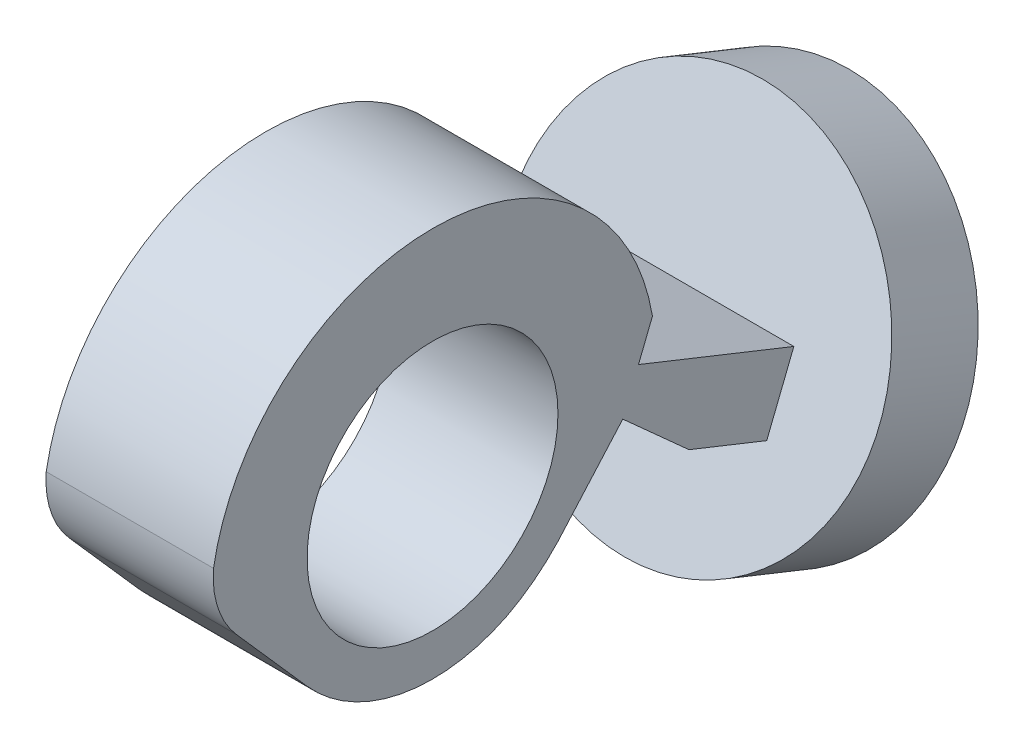
ISO-10303-21;
HEADER;
FILE_DESCRIPTION(('STEP AP214'),'2;1');
FILE_NAME('part.step','',(''),(''),'','','');
FILE_SCHEMA(('AUTOMOTIVE_DESIGN { 1 0 10303 214 1 1 1 1 }'));
ENDSEC;
DATA;
#1=APPLICATION_CONTEXT('core data for automotive mechanical design processes');
#2=APPLICATION_PROTOCOL_DEFINITION('international standard','automotive_design',2000,#1);
#3=PRODUCT_CONTEXT('',#1,'mechanical');
#4=PRODUCT('Part','Part','',(#3));
#5=PRODUCT_RELATED_PRODUCT_CATEGORY('part','',(#4));
#6=PRODUCT_DEFINITION_FORMATION('','',#4);
#7=PRODUCT_DEFINITION_CONTEXT('part definition',#1,'design');
#8=PRODUCT_DEFINITION('design','',#6,#7);
#9=PRODUCT_DEFINITION_SHAPE('','',#8);
#10=(LENGTH_UNIT() NAMED_UNIT(*) SI_UNIT(.MILLI.,.METRE.));
#11=(NAMED_UNIT(*) PLANE_ANGLE_UNIT() SI_UNIT($,.RADIAN.));
#12=(NAMED_UNIT(*) SI_UNIT($,.STERADIAN.) SOLID_ANGLE_UNIT());
#13=UNCERTAINTY_MEASURE_WITH_UNIT(LENGTH_MEASURE(1.E-05),#10,'distance_accuracy_value','');
#14=(GEOMETRIC_REPRESENTATION_CONTEXT(3) GLOBAL_UNCERTAINTY_ASSIGNED_CONTEXT((#13)) GLOBAL_UNIT_ASSIGNED_CONTEXT((#10,
#11,#12)) REPRESENTATION_CONTEXT('',''));
#15=CARTESIAN_POINT('',(0.,0.,0.));
#16=DIRECTION('',(0.,0.,1.));
#17=DIRECTION('',(1.,0.,0.));
#18=AXIS2_PLACEMENT_3D('',#15,#16,#17);
#19=CARTESIAN_POINT('',(9.,14.025494773348,-10.1138171957374));
#20=DIRECTION('',(1.,0.,0.));
#21=DIRECTION('',(0.,0.,-1.));
#22=AXIS2_PLACEMENT_3D('',#19,#20,#21);
#23=PLANE('',#22);
#24=DIRECTION('',(0.,0.668897649954775,0.743354514269591));
#25=VECTOR('',#24,1.);
#26=CARTESIAN_POINT('',(9.,17.9886332204524,-13.6799944944901));
#27=LINE('',#26,#25);
#28=CARTESIAN_POINT('',(9.,8.79597256603114,-23.8959158631397));
#29=VERTEX_POINT('',#28);
#30=CARTESIAN_POINT('',(9.,12.0039051069543,-20.3308993977227));
#31=VERTEX_POINT('',#30);
#32=EDGE_CURVE('E184',#29,#31,#27,.T.);
#33=ORIENTED_EDGE('',*,*,#32,.F.);
#34=DIRECTION('',(0.,0.370588457757987,0.928797176447343));
#35=VECTOR('',#34,1.);
#36=CARTESIAN_POINT('',(9.,10.4636206259421,-19.7163285691267));
#37=LINE('',#36,#35);
#38=CARTESIAN_POINT('',(9.,7.1283245061202,-28.0755031571527));
#39=VERTEX_POINT('',#38);
#40=EDGE_CURVE('E190',#39,#29,#37,.T.);
#41=ORIENTED_EDGE('',*,*,#40,.F.);
#42=DIRECTION('',(0.,0.928797176447343,-0.370588457757988));
#43=VECTOR('',#42,1.);
#44=CARTESIAN_POINT('',(9.,13.5738752916926,-30.6472667085479));
#45=LINE('',#44,#43);
#46=CARTESIAN_POINT('',(9.,10.7874837623506,-29.535501335274));
#47=VERTEX_POINT('',#46);
#48=EDGE_CURVE('E212',#39,#47,#45,.T.);
#49=ORIENTED_EDGE('',*,*,#48,.T.);
#50=DIRECTION('',(0.,-0.370588457757987,-0.928797176447343));
#51=VECTOR('',#50,1.);
#52=CARTESIAN_POINT('',(9.,10.7874837623506,-29.535501335274));
#53=LINE('',#52,#51);
#54=CARTESIAN_POINT('',(9.,14.1227798821725,-21.1763267472479));
#55=VERTEX_POINT('',#54);
#56=EDGE_CURVE('E199',#55,#47,#53,.T.);
#57=ORIENTED_EDGE('',*,*,#56,.F.);
#58=DIRECTION('',(0.,0.928797176447343,-0.370588457757987));
#59=VECTOR('',#58,1.);
#60=CARTESIAN_POINT('',(9.,14.1227798821725,-21.1763267472479));
#61=LINE('',#60,#59);
#62=CARTESIAN_POINT('',(9.,16.0039051069543,-21.9268924397148));
#63=VERTEX_POINT('',#62);
#64=EDGE_CURVE('E205',#55,#63,#61,.T.);
#65=ORIENTED_EDGE('',*,*,#64,.T.);
#66=CARTESIAN_POINT('',(9.,14.025494773348,-10.1138171957374));
#67=DIRECTION('',(1.,0.,0.));
#68=DIRECTION('',(0.,0.,-1.));
#69=AXIS2_PLACEMENT_3D('',#66,#67,#68);
#70=CIRCLE('',#69,11.977598013291);
#71=CARTESIAN_POINT('',(9.,16.0631168379134,1.68918879807576));
#72=VERTEX_POINT('',#71);
#73=EDGE_CURVE('E227',#63,#72,#70,.T.);
#74=ORIENTED_EDGE('',*,*,#73,.T.);
#75=CARTESIAN_POINT('',(9.,15.6665736708839,-3.29505313399469));
#76=DIRECTION('',(1.,0.,0.));
#77=DIRECTION('',(0.,0.,-1.));
#78=AXIS2_PLACEMENT_3D('',#75,#76,#77);
#79=CIRCLE('',#78,4.99999141206534);
#80=CARTESIAN_POINT('',(9.,12.3593919486514,0.454941956249968));
#81=VERTEX_POINT('',#80);
#82=EDGE_CURVE('E230',#72,#81,#79,.T.);
#83=ORIENTED_EDGE('',*,*,#82,.T.);
#84=DIRECTION('',(0.,-0.750000306239657,-0.661437480522854));
#85=VECTOR('',#84,1.);
#86=CARTESIAN_POINT('',(9.,12.3593919486514,0.454941956249968));
#87=LINE('',#86,#85);
#88=CARTESIAN_POINT('',(9.,8.0509660945459,-3.34472894821562));
#89=VERTEX_POINT('',#88);
#90=EDGE_CURVE('E233',#81,#89,#87,.T.);
#91=ORIENTED_EDGE('',*,*,#90,.T.);
#92=CARTESIAN_POINT('',(9.,14.0039030768003,-10.094731316069));
#93=DIRECTION('',(1.,0.,0.));
#94=DIRECTION('',(0.,0.,-1.));
#95=AXIS2_PLACEMENT_3D('',#92,#93,#94);
#96=CIRCLE('',#95,8.99999948226211);
#97=CARTESIAN_POINT('',(9.,5.92608719008415,-14.0632173222222));
#98=VERTEX_POINT('',#97);
#99=EDGE_CURVE('E235',#89,#98,#96,.T.);
#100=ORIENTED_EDGE('',*,*,#99,.T.);
#101=CARTESIAN_POINT('',(9.,14.9561374576593,-9.36729896403544));
#102=DIRECTION('',(1.,0.,0.));
#103=DIRECTION('',(0.,0.,-1.));
#104=AXIS2_PLACEMENT_3D('',#101,#102,#103);
#105=CIRCLE('',#104,10.1780871022844);
#106=CARTESIAN_POINT('',(9.,8.05096321242302,-16.8447333973564));
#107=VERTEX_POINT('',#106);
#108=EDGE_CURVE('E237',#98,#107,#105,.T.);
#109=ORIENTED_EDGE('',*,*,#108,.T.);
#110=DIRECTION('',(0.,0.750000100362902,-0.661437713965296));
#111=VECTOR('',#110,1.);
#112=CARTESIAN_POINT('',(9.,8.05096321242302,-16.8447333973564));
#113=LINE('',#112,#111);
#114=EDGE_CURVE('E239',#107,#31,#113,.T.);
#115=ORIENTED_EDGE('',*,*,#114,.T.);
#116=EDGE_LOOP('',(#33,#41,#49,#57,#65,#74,#83,#91,#100,#109,#115));
#117=FACE_BOUND('',#116,.T.);
#118=CARTESIAN_POINT('',(9.,14.0039030768003,-10.094731316069));
#119=DIRECTION('',(1.,0.,0.));
#120=DIRECTION('',(0.,0.,-1.));
#121=AXIS2_PLACEMENT_3D('',#118,#119,#120);
#122=CIRCLE('',#121,6.75000198519631);
#123=CARTESIAN_POINT('',(9.,14.0039030768003,-16.8447333012653));
#124=VERTEX_POINT('',#123);
#125=EDGE_CURVE('E221',#124,#124,#122,.T.);
#126=ORIENTED_EDGE('',*,*,#125,.F.);
#127=EDGE_LOOP('',(#126));
#128=FACE_BOUND('',#127,.T.);
#129=ADVANCED_FACE('F39',(#117,#128),#23,.T.);
#130=CARTESIAN_POINT('',(0.,14.025494773348,-10.1138171957374));
#131=DIRECTION('',(1.,0.,0.));
#132=DIRECTION('',(0.,0.,-1.));
#133=AXIS2_PLACEMENT_3D('',#130,#131,#132);
#134=PLANE('',#133);
#135=CARTESIAN_POINT('',(0.,14.0039030768003,-10.094731316069));
#136=DIRECTION('',(1.,0.,0.));
#137=DIRECTION('',(0.,0.,-1.));
#138=AXIS2_PLACEMENT_3D('',#135,#136,#137);
#139=CIRCLE('',#138,6.75000198519631);
#140=CARTESIAN_POINT('',(0.,14.0039030768003,-16.8447333012653));
#141=VERTEX_POINT('',#140);
#142=EDGE_CURVE('E220',#141,#141,#139,.T.);
#143=ORIENTED_EDGE('',*,*,#142,.T.);
#144=EDGE_LOOP('',(#143));
#145=FACE_BOUND('',#144,.T.);
#146=DIRECTION('',(0.,-0.370588457757987,-0.928797176447343));
#147=VECTOR('',#146,1.);
#148=CARTESIAN_POINT('',(0.,10.4636206259421,-19.7163285691267));
#149=LINE('',#148,#147);
#150=CARTESIAN_POINT('',(0.,8.79597256603114,-23.8959158631397));
#151=VERTEX_POINT('',#150);
#152=CARTESIAN_POINT('',(0.,7.1283245061202,-28.0755031571527));
#153=VERTEX_POINT('',#152);
#154=EDGE_CURVE('E186',#151,#153,#149,.T.);
#155=ORIENTED_EDGE('',*,*,#154,.F.);
#156=DIRECTION('',(0.,-0.668897649954775,-0.743354514269591));
#157=VECTOR('',#156,1.);
#158=CARTESIAN_POINT('',(0.,12.0039051069543,-20.3308993977227));
#159=LINE('',#158,#157);
#160=CARTESIAN_POINT('',(0.,12.0039051069543,-20.3308993977227));
#161=VERTEX_POINT('',#160);
#162=EDGE_CURVE('E61',#161,#151,#159,.T.);
#163=ORIENTED_EDGE('',*,*,#162,.F.);
#164=DIRECTION('',(0.,0.750000100362902,-0.661437713965296));
#165=VECTOR('',#164,1.);
#166=CARTESIAN_POINT('',(0.,8.05096321242302,-16.8447333973564));
#167=LINE('',#166,#165);
#168=CARTESIAN_POINT('',(0.,8.05096321242302,-16.8447333973564));
#169=VERTEX_POINT('',#168);
#170=EDGE_CURVE('E231',#169,#161,#167,.T.);
#171=ORIENTED_EDGE('',*,*,#170,.F.);
#172=CARTESIAN_POINT('',(0.,14.9561374576593,-9.36729896403544));
#173=DIRECTION('',(1.,0.,0.));
#174=DIRECTION('',(0.,0.,-1.));
#175=AXIS2_PLACEMENT_3D('',#172,#173,#174);
#176=CIRCLE('',#175,10.1780871022844);
#177=CARTESIAN_POINT('',(0.,5.92608719008415,-14.0632173222222));
#178=VERTEX_POINT('',#177);
#179=EDGE_CURVE('E251',#178,#169,#176,.T.);
#180=ORIENTED_EDGE('',*,*,#179,.F.);
#181=CARTESIAN_POINT('',(0.,14.0039030768003,-10.094731316069));
#182=DIRECTION('',(1.,0.,0.));
#183=DIRECTION('',(0.,0.,-1.));
#184=AXIS2_PLACEMENT_3D('',#181,#182,#183);
#185=CIRCLE('',#184,8.99999948226211);
#186=CARTESIAN_POINT('',(0.,8.0509660945459,-3.34472894821562));
#187=VERTEX_POINT('',#186);
#188=EDGE_CURVE('E249',#187,#178,#185,.T.);
#189=ORIENTED_EDGE('',*,*,#188,.F.);
#190=DIRECTION('',(0.,-0.750000306239657,-0.661437480522854));
#191=VECTOR('',#190,1.);
#192=CARTESIAN_POINT('',(0.,12.3593919486514,0.454941956249968));
#193=LINE('',#192,#191);
#194=CARTESIAN_POINT('',(0.,12.3593919486514,0.454941956249968));
#195=VERTEX_POINT('',#194);
#196=EDGE_CURVE('E247',#195,#187,#193,.T.);
#197=ORIENTED_EDGE('',*,*,#196,.F.);
#198=CARTESIAN_POINT('',(0.,15.6665736708839,-3.29505313399469));
#199=DIRECTION('',(1.,0.,0.));
#200=DIRECTION('',(0.,0.,-1.));
#201=AXIS2_PLACEMENT_3D('',#198,#199,#200);
#202=CIRCLE('',#201,4.99999141206534);
#203=CARTESIAN_POINT('',(0.,16.0631168379134,1.68918879807576));
#204=VERTEX_POINT('',#203);
#205=EDGE_CURVE('E245',#204,#195,#202,.T.);
#206=ORIENTED_EDGE('',*,*,#205,.F.);
#207=CARTESIAN_POINT('',(0.,14.025494773348,-10.1138171957374));
#208=DIRECTION('',(1.,0.,0.));
#209=DIRECTION('',(0.,0.,-1.));
#210=AXIS2_PLACEMENT_3D('',#207,#208,#209);
#211=CIRCLE('',#210,11.977598013291);
#212=CARTESIAN_POINT('',(0.,16.0039051069543,-21.9268924397148));
#213=VERTEX_POINT('',#212);
#214=EDGE_CURVE('E224',#213,#204,#211,.T.);
#215=ORIENTED_EDGE('',*,*,#214,.F.);
#216=DIRECTION('',(0.,0.928797176447343,-0.370588457757987));
#217=VECTOR('',#216,1.);
#218=CARTESIAN_POINT('',(0.,14.1227798821725,-21.1763267472479));
#219=LINE('',#218,#217);
#220=CARTESIAN_POINT('',(0.,14.1227798821725,-21.1763267472479));
#221=VERTEX_POINT('',#220);
#222=EDGE_CURVE('E204',#221,#213,#219,.T.);
#223=ORIENTED_EDGE('',*,*,#222,.F.);
#224=DIRECTION('',(0.,0.370588457757987,0.928797176447343));
#225=VECTOR('',#224,1.);
#226=CARTESIAN_POINT('',(0.,10.7874837623506,-29.535501335274));
#227=LINE('',#226,#225);
#228=CARTESIAN_POINT('',(0.,10.7874837623506,-29.535501335274));
#229=VERTEX_POINT('',#228);
#230=EDGE_CURVE('E193',#229,#221,#227,.T.);
#231=ORIENTED_EDGE('',*,*,#230,.F.);
#232=DIRECTION('',(0.,-0.928797176447343,0.370588457757988));
#233=VECTOR('',#232,1.);
#234=CARTESIAN_POINT('',(0.,5.27073015322552,-27.3343262416368));
#235=LINE('',#234,#233);
#236=EDGE_CURVE('E208',#229,#153,#235,.T.);
#237=ORIENTED_EDGE('',*,*,#236,.T.);
#238=EDGE_LOOP('',(#155,#163,#171,#180,#189,#197,#206,#215,#223,#231,#237));
#239=FACE_BOUND('',#238,.T.);
#240=ADVANCED_FACE('F281',(#145,#239),#134,.F.);
#241=CARTESIAN_POINT('',(9.,14.025494773348,-10.1138171957374));
#242=DIRECTION('',(-1.,0.,0.));
#243=DIRECTION('',(0.,0.,1.));
#244=AXIS2_PLACEMENT_3D('',#241,#242,#243);
#245=CYLINDRICAL_SURFACE('',#244,11.977598013291);
#246=ORIENTED_EDGE('',*,*,#214,.T.);
#247=DIRECTION('',(-1.,0.,0.));
#248=VECTOR('',#247,1.);
#249=CARTESIAN_POINT('',(9.,16.0631168379134,1.68918879807576));
#250=LINE('',#249,#248);
#251=EDGE_CURVE('E47',#72,#204,#250,.T.);
#252=ORIENTED_EDGE('',*,*,#251,.F.);
#253=ORIENTED_EDGE('',*,*,#73,.F.);
#254=DIRECTION('',(-1.,0.,0.));
#255=VECTOR('',#254,1.);
#256=CARTESIAN_POINT('',(9.,16.0039051069543,-21.9268924397148));
#257=LINE('',#256,#255);
#258=EDGE_CURVE('E242',#63,#213,#257,.T.);
#259=ORIENTED_EDGE('',*,*,#258,.T.);
#260=EDGE_LOOP('',(#246,#252,#253,#259));
#261=FACE_BOUND('',#260,.T.);
#262=ADVANCED_FACE('F41',(#261),#245,.T.);
#263=CARTESIAN_POINT('',(9.,15.6665736708839,-3.29505313399469));
#264=DIRECTION('',(-1.,0.,0.));
#265=DIRECTION('',(0.,0.,1.));
#266=AXIS2_PLACEMENT_3D('',#263,#264,#265);
#267=CYLINDRICAL_SURFACE('',#266,4.99999141206534);
#268=ORIENTED_EDGE('',*,*,#205,.T.);
#269=DIRECTION('',(-1.,0.,0.));
#270=VECTOR('',#269,1.);
#271=CARTESIAN_POINT('',(9.,12.3593919486514,0.454941956249968));
#272=LINE('',#271,#270);
#273=EDGE_CURVE('E268',#81,#195,#272,.T.);
#274=ORIENTED_EDGE('',*,*,#273,.F.);
#275=ORIENTED_EDGE('',*,*,#82,.F.);
#276=ORIENTED_EDGE('',*,*,#251,.T.);
#277=EDGE_LOOP('',(#268,#274,#275,#276));
#278=FACE_BOUND('',#277,.T.);
#279=ADVANCED_FACE('F273',(#278),#267,.T.);
#280=CARTESIAN_POINT('',(9.,12.3593919486514,0.454941956249968));
#281=DIRECTION('',(0.,0.661437480522854,-0.750000306239657));
#282=DIRECTION('',(0.,0.750000306239657,0.661437480522854));
#283=AXIS2_PLACEMENT_3D('',#280,#281,#282);
#284=PLANE('',#283);
#285=ORIENTED_EDGE('',*,*,#196,.T.);
#286=DIRECTION('',(-1.,0.,0.));
#287=VECTOR('',#286,1.);
#288=CARTESIAN_POINT('',(9.,8.0509660945459,-3.34472894821562));
#289=LINE('',#288,#287);
#290=EDGE_CURVE('E265',#89,#187,#289,.T.);
#291=ORIENTED_EDGE('',*,*,#290,.F.);
#292=ORIENTED_EDGE('',*,*,#90,.F.);
#293=ORIENTED_EDGE('',*,*,#273,.T.);
#294=EDGE_LOOP('',(#285,#291,#292,#293));
#295=FACE_BOUND('',#294,.T.);
#296=ADVANCED_FACE('F288',(#295),#284,.F.);
#297=CARTESIAN_POINT('',(9.,14.0039030768003,-10.094731316069));
#298=DIRECTION('',(-1.,0.,0.));
#299=DIRECTION('',(0.,0.,1.));
#300=AXIS2_PLACEMENT_3D('',#297,#298,#299);
#301=CYLINDRICAL_SURFACE('',#300,8.99999948226211);
#302=ORIENTED_EDGE('',*,*,#188,.T.);
#303=DIRECTION('',(-1.,0.,0.));
#304=VECTOR('',#303,1.);
#305=CARTESIAN_POINT('',(9.,5.92608719008415,-14.0632173222222));
#306=LINE('',#305,#304);
#307=EDGE_CURVE('E262',#98,#178,#306,.T.);
#308=ORIENTED_EDGE('',*,*,#307,.F.);
#309=ORIENTED_EDGE('',*,*,#99,.F.);
#310=ORIENTED_EDGE('',*,*,#290,.T.);
#311=EDGE_LOOP('',(#302,#308,#309,#310));
#312=FACE_BOUND('',#311,.T.);
#313=ADVANCED_FACE('F292',(#312),#301,.T.);
#314=CARTESIAN_POINT('',(9.,14.9561374576593,-9.36729896403544));
#315=DIRECTION('',(-1.,0.,0.));
#316=DIRECTION('',(0.,0.,1.));
#317=AXIS2_PLACEMENT_3D('',#314,#315,#316);
#318=CYLINDRICAL_SURFACE('',#317,10.1780871022844);
#319=ORIENTED_EDGE('',*,*,#179,.T.);
#320=DIRECTION('',(-1.,0.,0.));
#321=VECTOR('',#320,1.);
#322=CARTESIAN_POINT('',(9.,8.05096321242302,-16.8447333973564));
#323=LINE('',#322,#321);
#324=EDGE_CURVE('E259',#107,#169,#323,.T.);
#325=ORIENTED_EDGE('',*,*,#324,.F.);
#326=ORIENTED_EDGE('',*,*,#108,.F.);
#327=ORIENTED_EDGE('',*,*,#307,.T.);
#328=EDGE_LOOP('',(#319,#325,#326,#327));
#329=FACE_BOUND('',#328,.T.);
#330=ADVANCED_FACE('F321',(#329),#318,.T.);
#331=CARTESIAN_POINT('',(9.,8.05096321242302,-16.8447333973564));
#332=DIRECTION('',(0.,0.661437713965296,0.750000100362902));
#333=DIRECTION('',(0.,-0.750000100362903,0.661437713965296));
#334=AXIS2_PLACEMENT_3D('',#331,#332,#333);
#335=PLANE('',#334);
#336=ORIENTED_EDGE('',*,*,#170,.T.);
#337=DIRECTION('',(-1.,0.,0.));
#338=VECTOR('',#337,1.);
#339=CARTESIAN_POINT('',(9.,12.0039051069543,-20.3308993977226));
#340=LINE('',#339,#338);
#341=EDGE_CURVE('E257',#31,#161,#340,.T.);
#342=ORIENTED_EDGE('',*,*,#341,.F.);
#343=ORIENTED_EDGE('',*,*,#114,.F.);
#344=ORIENTED_EDGE('',*,*,#324,.T.);
#345=EDGE_LOOP('',(#336,#342,#343,#344));
#346=FACE_BOUND('',#345,.T.);
#347=ADVANCED_FACE('F319',(#346),#335,.F.);
#348=CARTESIAN_POINT('',(9.,14.0039030768003,-10.094731316069));
#349=DIRECTION('',(-1.,0.,0.));
#350=DIRECTION('',(0.,0.,1.));
#351=AXIS2_PLACEMENT_3D('',#348,#349,#350);
#352=CYLINDRICAL_SURFACE('',#351,6.75000198519631);
#353=ORIENTED_EDGE('',*,*,#125,.T.);
#354=EDGE_LOOP('',(#353));
#355=FACE_BOUND('',#354,.T.);
#356=ORIENTED_EDGE('',*,*,#142,.F.);
#357=EDGE_LOOP('',(#356));
#358=FACE_BOUND('',#357,.T.);
#359=ADVANCED_FACE('F329',(#355,#358),#352,.F.);
#360=CARTESIAN_POINT('',(4.,9.80493789535185,-29.1434672434819));
#361=DIRECTION('',(0.,0.370588457757987,0.928797176447343));
#362=DIRECTION('',(0.,-0.928797176447343,0.370588457757987));
#363=AXIS2_PLACEMENT_3D('',#360,#361,#362);
#364=PLANE('',#363);
#365=ORIENTED_EDGE('',*,*,#48,.F.);
#366=DIRECTION('',(1.,0.,0.));
#367=VECTOR('',#366,1.);
#368=CARTESIAN_POINT('',(0.,7.1283245061202,-28.0755031571527));
#369=LINE('',#368,#367);
#370=EDGE_CURVE('E188',#153,#39,#369,.T.);
#371=ORIENTED_EDGE('',*,*,#370,.F.);
#372=ORIENTED_EDGE('',*,*,#236,.F.);
#373=DIRECTION('',(-1.,0.,0.));
#374=VECTOR('',#373,1.);
#375=CARTESIAN_POINT('',(0.,10.7874837623506,-29.535501335274));
#376=LINE('',#375,#374);
#377=EDGE_CURVE('E202',#47,#229,#376,.T.);
#378=ORIENTED_EDGE('',*,*,#377,.F.);
#379=EDGE_LOOP('',(#365,#371,#372,#378));
#380=FACE_BOUND('',#379,.T.);
#381=CARTESIAN_POINT('',(4.,9.80493789535185,-29.1434672434819));
#382=DIRECTION('',(0.,0.370588457757987,0.928797176447343));
#383=DIRECTION('',(0.,-0.928797176447343,0.370588457757987));
#384=AXIS2_PLACEMENT_3D('',#381,#382,#383);
#385=CIRCLE('',#384,10.0000008260781);
#386=CARTESIAN_POINT('',(4.,0.516965363619448,-25.4375823597671));
#387=VERTEX_POINT('',#386);
#388=EDGE_CURVE('E214',#387,#387,#385,.T.);
#389=ORIENTED_EDGE('',*,*,#388,.T.);
#390=EDGE_LOOP('',(#389));
#391=FACE_BOUND('',#390,.T.);
#392=ADVANCED_FACE('F309',(#380,#391),#364,.T.);
#393=CARTESIAN_POINT('',(4.,7.95199560656191,-33.7874531257187));
#394=DIRECTION('',(0.,-0.370588457757987,-0.928797176447343));
#395=DIRECTION('',(0.,0.928797176447343,-0.370588457757987));
#396=AXIS2_PLACEMENT_3D('',#393,#394,#395);
#397=PLANE('',#396);
#398=DIRECTION('',(0.,0.928797176447343,-0.370588457757987));
#399=VECTOR('',#398,1.);
#400=CARTESIAN_POINT('',(1.5,5.16560407721988,-32.6756877524447));
#401=LINE('',#400,#399);
#402=CARTESIAN_POINT('',(1.5,5.16560407721988,-32.6756877524447));
#403=VERTEX_POINT('',#402);
#404=CARTESIAN_POINT('',(1.5,10.7383871359039,-34.8992184989926));
#405=VERTEX_POINT('',#404);
#406=EDGE_CURVE('E54',#403,#405,#401,.T.);
#407=ORIENTED_EDGE('',*,*,#406,.F.);
#408=DIRECTION('',(-1.,0.,0.));
#409=VECTOR('',#408,1.);
#410=CARTESIAN_POINT('',(6.5,5.16560407721988,-32.6756877524447));
#411=LINE('',#410,#409);
#412=CARTESIAN_POINT('',(6.5,5.16560407721988,-32.6756877524447));
#413=VERTEX_POINT('',#412);
#414=EDGE_CURVE('E165',#413,#403,#411,.T.);
#415=ORIENTED_EDGE('',*,*,#414,.F.);
#416=DIRECTION('',(0.,-0.928797176447343,0.370588457757987));
#417=VECTOR('',#416,1.);
#418=CARTESIAN_POINT('',(6.5,5.16560407721988,-32.6756877524447));
#419=LINE('',#418,#417);
#420=CARTESIAN_POINT('',(6.5,10.7383871359039,-34.8992184989926));
#421=VERTEX_POINT('',#420);
#422=EDGE_CURVE('E168',#421,#413,#419,.T.);
#423=ORIENTED_EDGE('',*,*,#422,.F.);
#424=DIRECTION('',(1.,0.,0.));
#425=VECTOR('',#424,1.);
#426=CARTESIAN_POINT('',(6.5,10.7383871359039,-34.8992184989926));
#427=LINE('',#426,#425);
#428=EDGE_CURVE('E174',#405,#421,#427,.T.);
#429=ORIENTED_EDGE('',*,*,#428,.F.);
#430=EDGE_LOOP('',(#407,#415,#423,#429));
#431=FACE_BOUND('',#430,.T.);
#432=CARTESIAN_POINT('',(4.,7.95199560656191,-33.7874531257187));
#433=DIRECTION('',(0.,-0.370588457757987,-0.928797176447343));
#434=DIRECTION('',(0.,0.928797176447343,-0.370588457757987));
#435=AXIS2_PLACEMENT_3D('',#432,#433,#434);
#436=CIRCLE('',#435,10.0000008260781);
#437=CARTESIAN_POINT('',(4.,17.2399681382943,-37.4933380094335));
#438=VERTEX_POINT('',#437);
#439=EDGE_CURVE('E217',#438,#438,#436,.T.);
#440=ORIENTED_EDGE('',*,*,#439,.T.);
#441=EDGE_LOOP('',(#440));
#442=FACE_BOUND('',#441,.T.);
#443=ADVANCED_FACE('F346',(#431,#442),#397,.T.);
#444=CARTESIAN_POINT('',(4.,7.95199560656191,-33.7874531257187));
#445=DIRECTION('',(0.,0.370588457757987,0.928797176447343));
#446=DIRECTION('',(0.,-0.928797176447343,0.370588457757987));
#447=AXIS2_PLACEMENT_3D('',#444,#445,#446);
#448=CYLINDRICAL_SURFACE('',#447,10.0000008260781);
#449=ORIENTED_EDGE('',*,*,#439,.F.);
#450=EDGE_LOOP('',(#449));
#451=FACE_BOUND('',#450,.T.);
#452=ORIENTED_EDGE('',*,*,#388,.F.);
#453=EDGE_LOOP('',(#452));
#454=FACE_BOUND('',#453,.T.);
#455=ADVANCED_FACE('F343',(#451,#454),#448,.T.);
#456=CARTESIAN_POINT('',(0.,14.1227798821725,-21.1763267472479));
#457=DIRECTION('',(0.,0.370588457757987,0.928797176447343));
#458=DIRECTION('',(0.,-0.928797176447343,0.370588457757987));
#459=AXIS2_PLACEMENT_3D('',#456,#457,#458);
#460=PLANE('',#459);
#461=ORIENTED_EDGE('',*,*,#64,.F.);
#462=DIRECTION('',(1.,0.,0.));
#463=VECTOR('',#462,1.);
#464=CARTESIAN_POINT('',(0.,14.1227798821725,-21.1763267472479));
#465=LINE('',#464,#463);
#466=EDGE_CURVE('E196',#221,#55,#465,.T.);
#467=ORIENTED_EDGE('',*,*,#466,.F.);
#468=ORIENTED_EDGE('',*,*,#222,.T.);
#469=ORIENTED_EDGE('',*,*,#258,.F.);
#470=EDGE_LOOP('',(#461,#467,#468,#469));
#471=FACE_BOUND('',#470,.T.);
#472=ADVANCED_FACE('F301',(#471),#460,.F.);
#473=CARTESIAN_POINT('',(0.,19.4721402480854,-7.76935008716008));
#474=DIRECTION('',(0.,0.928797176447343,-0.370588457757987));
#475=DIRECTION('',(0.,0.370588457757987,0.928797176447343));
#476=AXIS2_PLACEMENT_3D('',#473,#474,#475);
#477=PLANE('',#476);
#478=ORIENTED_EDGE('',*,*,#230,.T.);
#479=ORIENTED_EDGE('',*,*,#466,.T.);
#480=ORIENTED_EDGE('',*,*,#56,.T.);
#481=ORIENTED_EDGE('',*,*,#377,.T.);
#482=EDGE_LOOP('',(#478,#479,#480,#481));
#483=FACE_BOUND('',#482,.T.);
#484=ADVANCED_FACE('F303',(#483),#477,.T.);
#485=CARTESIAN_POINT('',(0.,15.812980991855,-6.30935190903884));
#486=DIRECTION('',(0.,-0.928797176447343,0.370588457757987));
#487=DIRECTION('',(0.,-0.370588457757987,-0.928797176447343));
#488=AXIS2_PLACEMENT_3D('',#485,#486,#487);
#489=PLANE('',#488);
#490=DIRECTION('',(1.,0.,0.));
#491=VECTOR('',#490,1.);
#492=CARTESIAN_POINT('',(0.,8.79597256603114,-23.8959158631397));
#493=LINE('',#492,#491);
#494=EDGE_CURVE('E11',#151,#29,#493,.T.);
#495=ORIENTED_EDGE('',*,*,#494,.F.);
#496=ORIENTED_EDGE('',*,*,#154,.T.);
#497=ORIENTED_EDGE('',*,*,#370,.T.);
#498=ORIENTED_EDGE('',*,*,#40,.T.);
#499=EDGE_LOOP('',(#495,#496,#497,#498));
#500=FACE_BOUND('',#499,.T.);
#501=ADVANCED_FACE('F313',(#500),#489,.T.);
#502=CARTESIAN_POINT('',(9.99999999999999,12.0039051069543,-20.3308993977227));
#503=DIRECTION('',(0.,0.743354514269591,-0.668897649954775));
#504=DIRECTION('',(0.,0.668897649954775,0.743354514269591));
#505=AXIS2_PLACEMENT_3D('',#502,#503,#504);
#506=PLANE('',#505);
#507=ORIENTED_EDGE('',*,*,#32,.T.);
#508=ORIENTED_EDGE('',*,*,#341,.T.);
#509=ORIENTED_EDGE('',*,*,#162,.T.);
#510=ORIENTED_EDGE('',*,*,#494,.T.);
#511=EDGE_LOOP('',(#507,#508,#509,#510));
#512=FACE_BOUND('',#511,.T.);
#513=ADVANCED_FACE('F316',(#512),#506,.F.);
#514=CARTESIAN_POINT('',(1.5,6.27736945049384,-29.8892962231027));
#515=DIRECTION('',(-1.,0.,0.));
#516=DIRECTION('',(0.,0.,1.));
#517=AXIS2_PLACEMENT_3D('',#514,#515,#516);
#518=PLANE('',#517);
#519=ORIENTED_EDGE('',*,*,#406,.T.);
#520=DIRECTION('',(0.,-0.370588457757987,-0.928797176447343));
#521=VECTOR('',#520,1.);
#522=CARTESIAN_POINT('',(1.5,11.8501525091779,-32.1128269696506));
#523=LINE('',#522,#521);
#524=CARTESIAN_POINT('',(1.5,11.8501525091779,-32.1128269696506));
#525=VERTEX_POINT('',#524);
#526=EDGE_CURVE('E143',#525,#405,#523,.T.);
#527=ORIENTED_EDGE('',*,*,#526,.F.);
#528=DIRECTION('',(0.,0.928797176447343,-0.370588457757987));
#529=VECTOR('',#528,1.);
#530=CARTESIAN_POINT('',(1.5,6.27736945049384,-29.8892962231027));
#531=LINE('',#530,#529);
#532=CARTESIAN_POINT('',(1.5,6.27736945049384,-29.8892962231027));
#533=VERTEX_POINT('',#532);
#534=EDGE_CURVE('E147',#533,#525,#531,.T.);
#535=ORIENTED_EDGE('',*,*,#534,.F.);
#536=DIRECTION('',(0.,-0.370588457757987,-0.928797176447343));
#537=VECTOR('',#536,1.);
#538=CARTESIAN_POINT('',(1.5,6.27736945049384,-29.8892962231027));
#539=LINE('',#538,#537);
#540=EDGE_CURVE('E178',#533,#403,#539,.T.);
#541=ORIENTED_EDGE('',*,*,#540,.T.);
#542=EDGE_LOOP('',(#519,#527,#535,#541));
#543=FACE_BOUND('',#542,.T.);
#544=ADVANCED_FACE('F145',(#543),#518,.F.);
#545=CARTESIAN_POINT('',(6.5,6.27736945049384,-29.8892962231027));
#546=DIRECTION('',(0.,-0.928797176447343,0.370588457757987));
#547=DIRECTION('',(0.,-0.370588457757987,-0.928797176447343));
#548=AXIS2_PLACEMENT_3D('',#545,#546,#547);
#549=PLANE('',#548);
#550=ORIENTED_EDGE('',*,*,#414,.T.);
#551=ORIENTED_EDGE('',*,*,#540,.F.);
#552=DIRECTION('',(-1.,0.,0.));
#553=VECTOR('',#552,1.);
#554=CARTESIAN_POINT('',(6.5,6.27736945049384,-29.8892962231027));
#555=LINE('',#554,#553);
#556=CARTESIAN_POINT('',(6.5,6.27736945049384,-29.8892962231027));
#557=VERTEX_POINT('',#556);
#558=EDGE_CURVE('E153',#557,#533,#555,.T.);
#559=ORIENTED_EDGE('',*,*,#558,.F.);
#560=DIRECTION('',(0.,-0.370588457757987,-0.928797176447343));
#561=VECTOR('',#560,1.);
#562=CARTESIAN_POINT('',(6.5,6.27736945049384,-29.8892962231027));
#563=LINE('',#562,#561);
#564=EDGE_CURVE('E180',#557,#413,#563,.T.);
#565=ORIENTED_EDGE('',*,*,#564,.T.);
#566=EDGE_LOOP('',(#550,#551,#559,#565));
#567=FACE_BOUND('',#566,.T.);
#568=ADVANCED_FACE('F362',(#567),#549,.F.);
#569=CARTESIAN_POINT('',(6.5,6.27736945049384,-29.8892962231027));
#570=DIRECTION('',(1.,0.,0.));
#571=DIRECTION('',(0.,0.,-1.));
#572=AXIS2_PLACEMENT_3D('',#569,#570,#571);
#573=PLANE('',#572);
#574=ORIENTED_EDGE('',*,*,#422,.T.);
#575=ORIENTED_EDGE('',*,*,#564,.F.);
#576=DIRECTION('',(0.,-0.928797176447343,0.370588457757987));
#577=VECTOR('',#576,1.);
#578=CARTESIAN_POINT('',(6.5,6.27736945049384,-29.8892962231027));
#579=LINE('',#578,#577);
#580=CARTESIAN_POINT('',(6.5,11.8501525091779,-32.1128269696506));
#581=VERTEX_POINT('',#580);
#582=EDGE_CURVE('E161',#581,#557,#579,.T.);
#583=ORIENTED_EDGE('',*,*,#582,.F.);
#584=DIRECTION('',(0.,-0.370588457757987,-0.928797176447343));
#585=VECTOR('',#584,1.);
#586=CARTESIAN_POINT('',(6.5,11.8501525091779,-32.1128269696506));
#587=LINE('',#586,#585);
#588=EDGE_CURVE('E152',#581,#421,#587,.T.);
#589=ORIENTED_EDGE('',*,*,#588,.T.);
#590=EDGE_LOOP('',(#574,#575,#583,#589));
#591=FACE_BOUND('',#590,.T.);
#592=ADVANCED_FACE('F365',(#591),#573,.F.);
#593=CARTESIAN_POINT('',(6.5,11.8501525091779,-32.1128269696506));
#594=DIRECTION('',(0.,0.928797176447343,-0.370588457757987));
#595=DIRECTION('',(0.,0.370588457757987,0.928797176447343));
#596=AXIS2_PLACEMENT_3D('',#593,#594,#595);
#597=PLANE('',#596);
#598=ORIENTED_EDGE('',*,*,#428,.T.);
#599=ORIENTED_EDGE('',*,*,#588,.F.);
#600=DIRECTION('',(1.,0.,0.));
#601=VECTOR('',#600,1.);
#602=CARTESIAN_POINT('',(6.5,11.8501525091779,-32.1128269696506));
#603=LINE('',#602,#601);
#604=EDGE_CURVE('E156',#525,#581,#603,.T.);
#605=ORIENTED_EDGE('',*,*,#604,.F.);
#606=ORIENTED_EDGE('',*,*,#526,.T.);
#607=EDGE_LOOP('',(#598,#599,#605,#606));
#608=FACE_BOUND('',#607,.T.);
#609=ADVANCED_FACE('F157',(#608),#597,.F.);
#610=CARTESIAN_POINT('',(0.,-9.42583340125081,-23.6237456010086));
#611=DIRECTION('',(0.,0.370588457757987,0.928797176447343));
#612=DIRECTION('',(0.,-0.928797176447343,0.370588457757987));
#613=AXIS2_PLACEMENT_3D('',#610,#611,#612);
#614=PLANE('',#613);
#615=ORIENTED_EDGE('',*,*,#534,.T.);
#616=ORIENTED_EDGE('',*,*,#604,.T.);
#617=ORIENTED_EDGE('',*,*,#582,.T.);
#618=ORIENTED_EDGE('',*,*,#558,.T.);
#619=EDGE_LOOP('',(#615,#616,#617,#618));
#620=FACE_BOUND('',#619,.T.);
#621=ADVANCED_FACE('F163',(#620),#614,.F.);
#622=CLOSED_SHELL('',(#129,#240,#262,#279,#296,#313,#330,#347,#359,#392,#443,#455,#472,#484,
#501,#513,#544,#568,#592,#609,#621));
#623=MANIFOLD_SOLID_BREP('B2',#622);
#624=ADVANCED_BREP_SHAPE_REPRESENTATION('',(#18,#623),#14);
#625=SHAPE_DEFINITION_REPRESENTATION(#9,#624);
ENDSEC;
END-ISO-10303-21;
